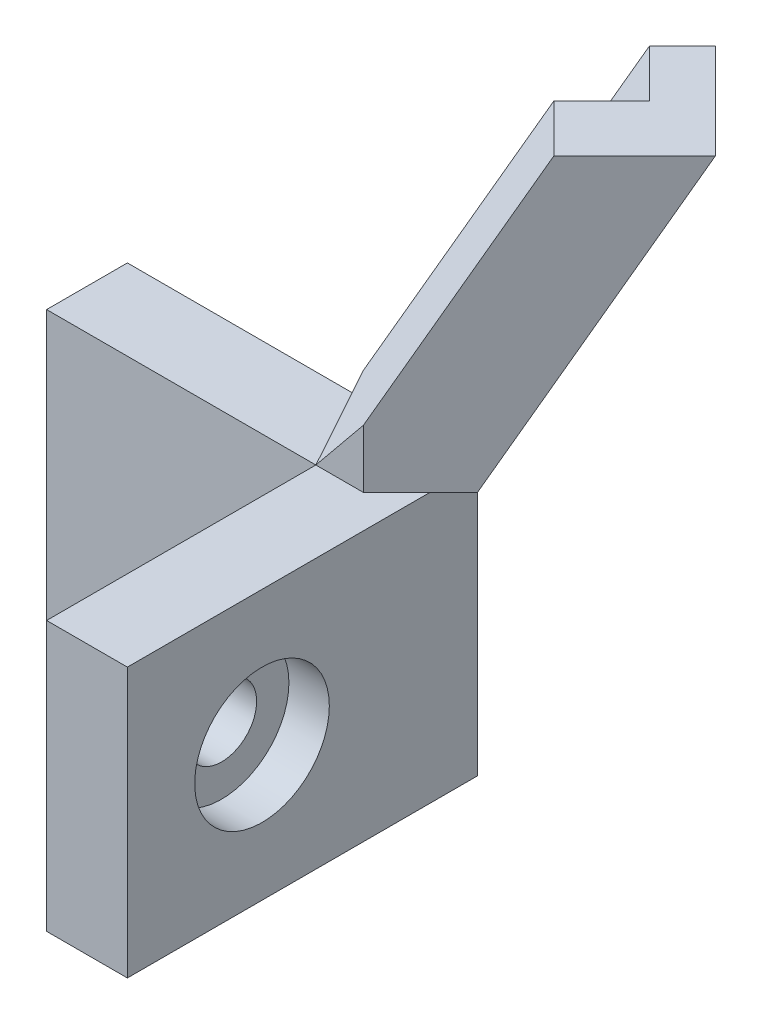
ISO-10303-21;
HEADER;
FILE_DESCRIPTION(('STEP AP214'),'2;1');
FILE_NAME('part.step','',(''),(''),'','','');
FILE_SCHEMA(('AUTOMOTIVE_DESIGN { 1 0 10303 214 1 1 1 1 }'));
ENDSEC;
DATA;
#1=APPLICATION_CONTEXT('core data for automotive mechanical design processes');
#2=APPLICATION_PROTOCOL_DEFINITION('international standard','automotive_design',2000,#1);
#3=PRODUCT_CONTEXT('',#1,'mechanical');
#4=PRODUCT('Part','Part','',(#3));
#5=PRODUCT_RELATED_PRODUCT_CATEGORY('part','',(#4));
#6=PRODUCT_DEFINITION_FORMATION('','',#4);
#7=PRODUCT_DEFINITION_CONTEXT('part definition',#1,'design');
#8=PRODUCT_DEFINITION('design','',#6,#7);
#9=PRODUCT_DEFINITION_SHAPE('','',#8);
#10=(LENGTH_UNIT() NAMED_UNIT(*) SI_UNIT(.MILLI.,.METRE.));
#11=(NAMED_UNIT(*) PLANE_ANGLE_UNIT() SI_UNIT($,.RADIAN.));
#12=(NAMED_UNIT(*) SI_UNIT($,.STERADIAN.) SOLID_ANGLE_UNIT());
#13=UNCERTAINTY_MEASURE_WITH_UNIT(LENGTH_MEASURE(1.E-05),#10,'distance_accuracy_value','');
#14=(GEOMETRIC_REPRESENTATION_CONTEXT(3) GLOBAL_UNCERTAINTY_ASSIGNED_CONTEXT((#13)) GLOBAL_UNIT_ASSIGNED_CONTEXT((#10,
#11,#12)) REPRESENTATION_CONTEXT('',''));
#15=CARTESIAN_POINT('',(0.,0.,0.));
#16=DIRECTION('',(0.,0.,1.));
#17=DIRECTION('',(1.,0.,0.));
#18=AXIS2_PLACEMENT_3D('',#15,#16,#17);
#19=CARTESIAN_POINT('',(-1.76776695296602,104.,-1.767766952966));
#20=DIRECTION('',(0.707106781186551,0.,0.707106781186544));
#21=DIRECTION('',(0.707106781186544,0.,-0.707106781186551));
#22=AXIS2_PLACEMENT_3D('',#19,#20,#21);
#23=PLANE('',#22);
#24=DIRECTION('',(0.353553390593272,0.866025403784439,-0.353553390593276));
#25=VECTOR('',#24,1.);
#26=CARTESIAN_POINT('',(-5.22860861701132,2.82576538582523,1.69307471107934));
#27=LINE('',#26,#25);
#28=CARTESIAN_POINT('',(4.16288269291295,25.8301270189222,-7.69841659884503));
#29=VERTEX_POINT('',#28);
#30=CARTESIAN_POINT('',(10.6215780690826,41.650635094611,-14.1571119750147));
#31=VERTEX_POINT('',#30);
#32=EDGE_CURVE('E221',#29,#31,#27,.T.);
#33=ORIENTED_EDGE('',*,*,#32,.F.);
#34=DIRECTION('',(0.353553390593275,0.866025403784436,-0.353553390593279));
#35=VECTOR('',#34,1.);
#36=CARTESIAN_POINT('',(4.16288269291294,25.8301270189222,-7.69841659884503));
#37=LINE('',#36,#35);
#38=CARTESIAN_POINT('',(1.78274330425076,20.,-5.31827721018282));
#39=VERTEX_POINT('',#38);
#40=EDGE_CURVE('E187',#39,#29,#37,.T.);
#41=ORIENTED_EDGE('',*,*,#40,.F.);
#42=DIRECTION('',(-0.707106781186544,0.,0.707106781186551));
#43=VECTOR('',#42,1.);
#44=CARTESIAN_POINT('',(-1.76776695296602,20.,-1.767766952966));
#45=LINE('',#44,#43);
#46=CARTESIAN_POINT('',(0.,20.,-3.53553390593204));
#47=VERTEX_POINT('',#46);
#48=EDGE_CURVE('E236',#39,#47,#45,.T.);
#49=ORIENTED_EDGE('',*,*,#48,.T.);
#50=DIRECTION('',(0.,-1.,0.));
#51=VECTOR('',#50,1.);
#52=CARTESIAN_POINT('',(0.,104.,-3.53553390593204));
#53=LINE('',#52,#51);
#54=CARTESIAN_POINT('',(0.,24.3301270189214,-3.53553390593205));
#55=VERTEX_POINT('',#54);
#56=EDGE_CURVE('E239',#55,#47,#53,.T.);
#57=ORIENTED_EDGE('',*,*,#56,.F.);
#58=DIRECTION('',(0.353553390593272,0.866025403784439,-0.353553390593276));
#59=VECTOR('',#58,1.);
#60=CARTESIAN_POINT('',(-7.89149130992393,5.,4.35595740399197));
#61=LINE('',#60,#59);
#62=CARTESIAN_POINT('',(7.07106781186578,41.650635094611,-10.6066017177979));
#63=VERTEX_POINT('',#62);
#64=EDGE_CURVE('E254',#55,#63,#61,.T.);
#65=ORIENTED_EDGE('',*,*,#64,.T.);
#66=DIRECTION('',(-0.707106781186544,0.,0.707106781186551));
#67=VECTOR('',#66,1.);
#68=CARTESIAN_POINT('',(-1.76776695296602,41.650635094611,-1.767766952966));
#69=LINE('',#68,#67);
#70=EDGE_CURVE('E251',#31,#63,#69,.T.);
#71=ORIENTED_EDGE('',*,*,#70,.F.);
#72=EDGE_LOOP('',(#33,#41,#49,#57,#65,#71));
#73=FACE_BOUND('',#72,.T.);
#74=ADVANCED_FACE('F41',(#73),#23,.F.);
#75=CARTESIAN_POINT('',(0.,104.,0.));
#76=DIRECTION('',(-1.,0.,0.));
#77=DIRECTION('',(0.,0.,1.));
#78=AXIS2_PLACEMENT_3D('',#75,#76,#77);
#79=PLANE('',#78);
#80=DIRECTION('',(0.,0.774596669241485,-0.632455532033674));
#81=VECTOR('',#80,1.);
#82=CARTESIAN_POINT('',(0.,70.4000000000002,-41.1514276787574));
#83=LINE('',#82,#81);
#84=CARTESIAN_POINT('',(0.,20.,0.));
#85=VERTEX_POINT('',#84);
#86=EDGE_CURVE('E277',#85,#55,#83,.T.);
#87=ORIENTED_EDGE('',*,*,#86,.T.);
#88=ORIENTED_EDGE('',*,*,#56,.T.);
#89=DIRECTION('',(0.,0.,-1.));
#90=VECTOR('',#89,1.);
#91=CARTESIAN_POINT('',(0.,20.,0.));
#92=LINE('',#91,#90);
#93=EDGE_CURVE('E284',#85,#47,#92,.T.);
#94=ORIENTED_EDGE('',*,*,#93,.F.);
#95=EDGE_LOOP('',(#87,#88,#94));
#96=FACE_BOUND('',#95,.T.);
#97=ADVANCED_FACE('F382',(#96),#79,.T.);
#98=CARTESIAN_POINT('',(0.,104.,0.));
#99=DIRECTION('',(0.,0.,1.));
#100=DIRECTION('',(1.,0.,0.));
#101=AXIS2_PLACEMENT_3D('',#98,#99,#100);
#102=PLANE('',#101);
#103=DIRECTION('',(-1.,0.,0.));
#104=VECTOR('',#103,1.);
#105=CARTESIAN_POINT('',(0.,20.,0.));
#106=LINE('',#105,#104);
#107=CARTESIAN_POINT('',(3.53553390593426,20.,0.));
#108=VERTEX_POINT('',#107);
#109=EDGE_CURVE('E50',#108,#85,#106,.T.);
#110=ORIENTED_EDGE('',*,*,#109,.F.);
#111=DIRECTION('',(0.,1.,0.));
#112=VECTOR('',#111,1.);
#113=CARTESIAN_POINT('',(3.53553390593425,104.,0.));
#114=LINE('',#113,#112);
#115=CARTESIAN_POINT('',(3.53553390593424,24.330127018924,0.));
#116=VERTEX_POINT('',#115);
#117=EDGE_CURVE('E247',#108,#116,#114,.T.);
#118=ORIENTED_EDGE('',*,*,#117,.T.);
#119=DIRECTION('',(-0.632455532033678,-0.774596669241482,0.));
#120=VECTOR('',#119,1.);
#121=CARTESIAN_POINT('',(41.1514276787575,70.3999999999998,0.));
#122=LINE('',#121,#120);
#123=EDGE_CURVE('E273',#116,#85,#122,.T.);
#124=ORIENTED_EDGE('',*,*,#123,.T.);
#125=EDGE_LOOP('',(#110,#118,#124));
#126=FACE_BOUND('',#125,.T.);
#127=ADVANCED_FACE('F388',(#126),#102,.T.);
#128=CARTESIAN_POINT('',(0.,20.,0.));
#129=DIRECTION('',(0.,1.,0.));
#130=DIRECTION('',(0.,0.,1.));
#131=AXIS2_PLACEMENT_3D('',#128,#129,#130);
#132=PLANE('',#131);
#133=DIRECTION('',(0.707106781186544,0.,-0.707106781186551));
#134=VECTOR('',#133,1.);
#135=CARTESIAN_POINT('',(7.76776695296711,20.,-4.2322330470329));
#136=LINE('',#135,#134);
#137=CARTESIAN_POINT('',(6.,20.,-2.46446609406577));
#138=VERTEX_POINT('',#137);
#139=CARTESIAN_POINT('',(7.76776695296711,20.,-4.2322330470329));
#140=VERTEX_POINT('',#139);
#141=EDGE_CURVE('E243',#138,#140,#136,.T.);
#142=ORIENTED_EDGE('',*,*,#141,.F.);
#143=DIRECTION('',(0.,0.,-1.));
#144=VECTOR('',#143,1.);
#145=CARTESIAN_POINT('',(6.,20.,-6.));
#146=LINE('',#145,#144);
#147=CARTESIAN_POINT('',(6.00000000000033,20.0000000000001,-5.99999999999968));
#148=VERTEX_POINT('',#147);
#149=EDGE_CURVE('E313',#138,#148,#146,.T.);
#150=ORIENTED_EDGE('',*,*,#149,.T.);
#151=DIRECTION('',(-0.707106781186551,0.,-0.707106781186544));
#152=VECTOR('',#151,1.);
#153=CARTESIAN_POINT('',(63.6292026667043,20.,51.6292026667036));
#154=LINE('',#153,#152);
#155=EDGE_CURVE('E194',#140,#148,#154,.T.);
#156=ORIENTED_EDGE('',*,*,#155,.F.);
#157=EDGE_LOOP('',(#142,#150,#156));
#158=FACE_BOUND('',#157,.T.);
#159=ADVANCED_FACE('F394',(#158),#132,.F.);
#160=CARTESIAN_POINT('',(51.5054783097464,5.,63.7529270236617));
#161=DIRECTION('',(-0.612372435695791,0.5,0.612372435695798));
#162=DIRECTION('',(0.707106781186551,0.,0.707106781186544));
#163=AXIS2_PLACEMENT_3D('',#160,#161,#162);
#164=PLANE('',#163);
#165=ORIENTED_EDGE('',*,*,#123,.F.);
#166=DIRECTION('',(-0.353553390593272,-0.866025403784439,0.353553390593276));
#167=VECTOR('',#166,1.);
#168=CARTESIAN_POINT('',(27.4874092521904,83.,-23.9518753462564));
#169=LINE('',#168,#167);
#170=CARTESIAN_POINT('',(10.6066017177989,41.650635094611,-7.07106781186477));
#171=VERTEX_POINT('',#170);
#172=EDGE_CURVE('E270',#171,#116,#169,.T.);
#173=ORIENTED_EDGE('',*,*,#172,.F.);
#174=DIRECTION('',(-0.707106781186551,0.,-0.707106781186544));
#175=VECTOR('',#174,1.);
#176=CARTESIAN_POINT('',(66.4680374315361,41.650635094611,48.7903679018718));
#177=LINE('',#176,#175);
#178=EDGE_CURVE('E262',#171,#63,#177,.T.);
#179=ORIENTED_EDGE('',*,*,#178,.T.);
#180=ORIENTED_EDGE('',*,*,#64,.F.);
#181=ORIENTED_EDGE('',*,*,#86,.F.);
#182=EDGE_LOOP('',(#165,#173,#179,#180,#181));
#183=FACE_BOUND('',#182,.T.);
#184=ADVANCED_FACE('F376',(#183),#164,.T.);
#185=CARTESIAN_POINT('',(0.,20.,0.));
#186=DIRECTION('',(0.,-1.,0.));
#187=DIRECTION('',(0.,0.,-1.));
#188=AXIS2_PLACEMENT_3D('',#185,#186,#187);
#189=PLANE('',#188);
#190=CARTESIAN_POINT('',(6.,20.,20.));
#191=VERTEX_POINT('',#190);
#192=EDGE_CURVE('E314',#191,#138,#146,.T.);
#193=ORIENTED_EDGE('',*,*,#192,.T.);
#194=EDGE_CURVE('E246',#108,#138,#136,.T.);
#195=ORIENTED_EDGE('',*,*,#194,.F.);
#196=ORIENTED_EDGE('',*,*,#109,.T.);
#197=DIRECTION('',(0.,0.,1.));
#198=VECTOR('',#197,1.);
#199=CARTESIAN_POINT('',(0.,20.,0.));
#200=LINE('',#199,#198);
#201=CARTESIAN_POINT('',(0.,20.,20.));
#202=VERTEX_POINT('',#201);
#203=EDGE_CURVE('E100',#85,#202,#200,.T.);
#204=ORIENTED_EDGE('',*,*,#203,.T.);
#205=DIRECTION('',(1.,0.,0.));
#206=VECTOR('',#205,1.);
#207=CARTESIAN_POINT('',(0.,20.,20.));
#208=LINE('',#207,#206);
#209=EDGE_CURVE('E310',#202,#191,#208,.T.);
#210=ORIENTED_EDGE('',*,*,#209,.T.);
#211=EDGE_LOOP('',(#193,#195,#196,#204,#210));
#212=FACE_BOUND('',#211,.T.);
#213=ADVANCED_FACE('F367',(#212),#189,.F.);
#214=CARTESIAN_POINT('',(-14.,10.,10.));
#215=DIRECTION('',(1.,0.,0.));
#216=DIRECTION('',(0.,0.,-1.));
#217=AXIS2_PLACEMENT_3D('',#214,#215,#216);
#218=CYLINDRICAL_SURFACE('',#217,2.6);
#219=CARTESIAN_POINT('',(0.,10.,10.));
#220=DIRECTION('',(1.,0.,0.));
#221=DIRECTION('',(0.,0.,-1.));
#222=AXIS2_PLACEMENT_3D('',#219,#220,#221);
#223=CIRCLE('',#222,2.6);
#224=CARTESIAN_POINT('',(0.,10.,7.4));
#225=VERTEX_POINT('',#224);
#226=EDGE_CURVE('E300',#225,#225,#223,.T.);
#227=ORIENTED_EDGE('',*,*,#226,.F.);
#228=EDGE_LOOP('',(#227));
#229=FACE_BOUND('',#228,.T.);
#230=CARTESIAN_POINT('',(3.,10.,10.));
#231=DIRECTION('',(1.,0.,0.));
#232=DIRECTION('',(0.,0.,-1.));
#233=AXIS2_PLACEMENT_3D('',#230,#231,#232);
#234=CIRCLE('',#233,2.6);
#235=CARTESIAN_POINT('',(3.,10.,7.4));
#236=VERTEX_POINT('',#235);
#237=EDGE_CURVE('E296',#236,#236,#234,.F.);
#238=ORIENTED_EDGE('',*,*,#237,.F.);
#239=EDGE_LOOP('',(#238));
#240=FACE_BOUND('',#239,.T.);
#241=ADVANCED_FACE('F365',(#229,#240),#218,.F.);
#242=CARTESIAN_POINT('',(0.,20.,0.));
#243=DIRECTION('',(0.,0.,-1.));
#244=DIRECTION('',(-1.,0.,0.));
#245=AXIS2_PLACEMENT_3D('',#242,#243,#244);
#246=PLANE('',#245);
#247=DIRECTION('',(1.,0.,0.));
#248=VECTOR('',#247,1.);
#249=CARTESIAN_POINT('',(0.,0.,0.));
#250=LINE('',#249,#248);
#251=CARTESIAN_POINT('',(-20.,0.,0.));
#252=VERTEX_POINT('',#251);
#253=CARTESIAN_POINT('',(0.,0.,0.));
#254=VERTEX_POINT('',#253);
#255=EDGE_CURVE('E304',#252,#254,#250,.T.);
#256=ORIENTED_EDGE('',*,*,#255,.T.);
#257=DIRECTION('',(0.,-1.,0.));
#258=VECTOR('',#257,1.);
#259=CARTESIAN_POINT('',(0.,20.,0.));
#260=LINE('',#259,#258);
#261=EDGE_CURVE('E291',#85,#254,#260,.T.);
#262=ORIENTED_EDGE('',*,*,#261,.F.);
#263=DIRECTION('',(1.,0.,0.));
#264=VECTOR('',#263,1.);
#265=CARTESIAN_POINT('',(0.,20.,0.));
#266=LINE('',#265,#264);
#267=CARTESIAN_POINT('',(-20.,20.,0.));
#268=VERTEX_POINT('',#267);
#269=EDGE_CURVE('E305',#268,#85,#266,.T.);
#270=ORIENTED_EDGE('',*,*,#269,.F.);
#271=DIRECTION('',(0.,-1.,0.));
#272=VECTOR('',#271,1.);
#273=CARTESIAN_POINT('',(-20.,20.,0.));
#274=LINE('',#273,#272);
#275=EDGE_CURVE('E322',#268,#252,#274,.T.);
#276=ORIENTED_EDGE('',*,*,#275,.T.);
#277=EDGE_LOOP('',(#256,#262,#270,#276));
#278=FACE_BOUND('',#277,.T.);
#279=ADVANCED_FACE('F43',(#278),#246,.F.);
#280=CARTESIAN_POINT('',(0.,20.,0.));
#281=DIRECTION('',(1.,0.,0.));
#282=DIRECTION('',(0.,0.,-1.));
#283=AXIS2_PLACEMENT_3D('',#280,#281,#282);
#284=PLANE('',#283);
#285=ORIENTED_EDGE('',*,*,#226,.T.);
#286=EDGE_LOOP('',(#285));
#287=FACE_BOUND('',#286,.T.);
#288=DIRECTION('',(0.,0.,1.));
#289=VECTOR('',#288,1.);
#290=CARTESIAN_POINT('',(0.,0.,0.));
#291=LINE('',#290,#289);
#292=CARTESIAN_POINT('',(0.,0.,20.));
#293=VERTEX_POINT('',#292);
#294=EDGE_CURVE('E326',#254,#293,#291,.T.);
#295=ORIENTED_EDGE('',*,*,#294,.T.);
#296=DIRECTION('',(0.,-1.,0.));
#297=VECTOR('',#296,1.);
#298=CARTESIAN_POINT('',(0.,20.,20.));
#299=LINE('',#298,#297);
#300=EDGE_CURVE('E353',#202,#293,#299,.T.);
#301=ORIENTED_EDGE('',*,*,#300,.F.);
#302=ORIENTED_EDGE('',*,*,#203,.F.);
#303=ORIENTED_EDGE('',*,*,#261,.T.);
#304=EDGE_LOOP('',(#295,#301,#302,#303));
#305=FACE_BOUND('',#304,.T.);
#306=ADVANCED_FACE('F374',(#287,#305),#284,.F.);
#307=CARTESIAN_POINT('',(0.,20.,20.));
#308=DIRECTION('',(0.,0.,-1.));
#309=DIRECTION('',(-1.,0.,0.));
#310=AXIS2_PLACEMENT_3D('',#307,#308,#309);
#311=PLANE('',#310);
#312=DIRECTION('',(1.,0.,0.));
#313=VECTOR('',#312,1.);
#314=CARTESIAN_POINT('',(0.,0.,20.));
#315=LINE('',#314,#313);
#316=CARTESIAN_POINT('',(6.,0.,20.));
#317=VERTEX_POINT('',#316);
#318=EDGE_CURVE('E329',#293,#317,#315,.T.);
#319=ORIENTED_EDGE('',*,*,#318,.T.);
#320=DIRECTION('',(0.,-1.,0.));
#321=VECTOR('',#320,1.);
#322=CARTESIAN_POINT('',(6.,20.,20.));
#323=LINE('',#322,#321);
#324=EDGE_CURVE('E349',#191,#317,#323,.T.);
#325=ORIENTED_EDGE('',*,*,#324,.F.);
#326=ORIENTED_EDGE('',*,*,#209,.F.);
#327=ORIENTED_EDGE('',*,*,#300,.T.);
#328=EDGE_LOOP('',(#319,#325,#326,#327));
#329=FACE_BOUND('',#328,.T.);
#330=ADVANCED_FACE('F419',(#329),#311,.F.);
#331=CARTESIAN_POINT('',(6.,20.,-6.));
#332=DIRECTION('',(-1.,0.,0.));
#333=DIRECTION('',(0.,0.,1.));
#334=AXIS2_PLACEMENT_3D('',#331,#332,#333);
#335=PLANE('',#334);
#336=CARTESIAN_POINT('',(6.,10.,10.));
#337=DIRECTION('',(1.,0.,0.));
#338=DIRECTION('',(0.,0.,-1.));
#339=AXIS2_PLACEMENT_3D('',#336,#337,#338);
#340=CIRCLE('',#339,5.);
#341=CARTESIAN_POINT('',(6.,10.,5.));
#342=VERTEX_POINT('',#341);
#343=EDGE_CURVE('E288',#342,#342,#340,.T.);
#344=ORIENTED_EDGE('',*,*,#343,.F.);
#345=EDGE_LOOP('',(#344));
#346=FACE_BOUND('',#345,.T.);
#347=DIRECTION('',(0.,0.,-1.));
#348=VECTOR('',#347,1.);
#349=CARTESIAN_POINT('',(6.,0.,-6.));
#350=LINE('',#349,#348);
#351=CARTESIAN_POINT('',(6.,0.,-6.));
#352=VERTEX_POINT('',#351);
#353=EDGE_CURVE('E332',#317,#352,#350,.T.);
#354=ORIENTED_EDGE('',*,*,#353,.T.);
#355=DIRECTION('',(0.,-1.,0.));
#356=VECTOR('',#355,1.);
#357=CARTESIAN_POINT('',(6.,20.,-6.));
#358=LINE('',#357,#356);
#359=EDGE_CURVE('E345',#148,#352,#358,.T.);
#360=ORIENTED_EDGE('',*,*,#359,.F.);
#361=ORIENTED_EDGE('',*,*,#149,.F.);
#362=ORIENTED_EDGE('',*,*,#192,.F.);
#363=ORIENTED_EDGE('',*,*,#324,.T.);
#364=EDGE_LOOP('',(#354,#360,#361,#362,#363));
#365=FACE_BOUND('',#364,.T.);
#366=ADVANCED_FACE('F415',(#346,#365),#335,.F.);
#367=CARTESIAN_POINT('',(-20.,20.,-6.));
#368=DIRECTION('',(0.,0.,1.));
#369=DIRECTION('',(1.,0.,0.));
#370=AXIS2_PLACEMENT_3D('',#367,#368,#369);
#371=PLANE('',#370);
#372=DIRECTION('',(-1.,0.,0.));
#373=VECTOR('',#372,1.);
#374=CARTESIAN_POINT('',(-20.,0.,-6.));
#375=LINE('',#374,#373);
#376=CARTESIAN_POINT('',(-20.,0.,-6.));
#377=VERTEX_POINT('',#376);
#378=EDGE_CURVE('E335',#352,#377,#375,.T.);
#379=ORIENTED_EDGE('',*,*,#378,.T.);
#380=DIRECTION('',(0.,-1.,0.));
#381=VECTOR('',#380,1.);
#382=CARTESIAN_POINT('',(-20.,20.,-6.));
#383=LINE('',#382,#381);
#384=CARTESIAN_POINT('',(-20.,20.,-6.));
#385=VERTEX_POINT('',#384);
#386=EDGE_CURVE('E342',#385,#377,#383,.T.);
#387=ORIENTED_EDGE('',*,*,#386,.F.);
#388=DIRECTION('',(-1.,0.,0.));
#389=VECTOR('',#388,1.);
#390=CARTESIAN_POINT('',(-20.,20.,-6.));
#391=LINE('',#390,#389);
#392=EDGE_CURVE('E317',#148,#385,#391,.T.);
#393=ORIENTED_EDGE('',*,*,#392,.F.);
#394=ORIENTED_EDGE('',*,*,#359,.T.);
#395=EDGE_LOOP('',(#379,#387,#393,#394));
#396=FACE_BOUND('',#395,.T.);
#397=ADVANCED_FACE('F418',(#396),#371,.F.);
#398=CARTESIAN_POINT('',(-20.,20.,0.));
#399=DIRECTION('',(1.,0.,0.));
#400=DIRECTION('',(0.,0.,-1.));
#401=AXIS2_PLACEMENT_3D('',#398,#399,#400);
#402=PLANE('',#401);
#403=DIRECTION('',(0.,0.,1.));
#404=VECTOR('',#403,1.);
#405=CARTESIAN_POINT('',(-20.,0.,0.));
#406=LINE('',#405,#404);
#407=EDGE_CURVE('E92',#377,#252,#406,.T.);
#408=ORIENTED_EDGE('',*,*,#407,.T.);
#409=ORIENTED_EDGE('',*,*,#275,.F.);
#410=DIRECTION('',(0.,0.,1.));
#411=VECTOR('',#410,1.);
#412=CARTESIAN_POINT('',(-20.,20.,0.));
#413=LINE('',#412,#411);
#414=EDGE_CURVE('E65',#385,#268,#413,.T.);
#415=ORIENTED_EDGE('',*,*,#414,.F.);
#416=ORIENTED_EDGE('',*,*,#386,.T.);
#417=EDGE_LOOP('',(#408,#409,#415,#416));
#418=FACE_BOUND('',#417,.T.);
#419=ADVANCED_FACE('F434',(#418),#402,.F.);
#420=ORIENTED_EDGE('',*,*,#392,.T.);
#421=ORIENTED_EDGE('',*,*,#414,.T.);
#422=ORIENTED_EDGE('',*,*,#269,.T.);
#423=ORIENTED_EDGE('',*,*,#93,.T.);
#424=ORIENTED_EDGE('',*,*,#48,.F.);
#425=DIRECTION('',(-0.707106781186551,0.,-0.707106781186544));
#426=VECTOR('',#425,1.);
#427=CARTESIAN_POINT('',(3.55051025721714,20.,-3.55051025721646));
#428=LINE('',#427,#426);
#429=CARTESIAN_POINT('',(3.55051025721714,20.,-3.55051025721646));
#430=VERTEX_POINT('',#429);
#431=EDGE_CURVE('E204',#430,#39,#428,.T.);
#432=ORIENTED_EDGE('',*,*,#431,.F.);
#433=DIRECTION('',(-0.707106781186544,0.,0.707106781186551));
#434=VECTOR('',#433,1.);
#435=CARTESIAN_POINT('',(3.55051025721714,20.,-3.55051025721646));
#436=LINE('',#435,#434);
#437=EDGE_CURVE('E197',#148,#430,#436,.T.);
#438=ORIENTED_EDGE('',*,*,#437,.F.);
#439=EDGE_LOOP('',(#420,#421,#422,#423,#424,#432,#438));
#440=FACE_BOUND('',#439,.T.);
#441=ADVANCED_FACE('F378',(#440),#189,.F.);
#442=CARTESIAN_POINT('',(0.,0.,0.));
#443=DIRECTION('',(0.,-1.,0.));
#444=DIRECTION('',(0.,0.,-1.));
#445=AXIS2_PLACEMENT_3D('',#442,#443,#444);
#446=PLANE('',#445);
#447=ORIENTED_EDGE('',*,*,#255,.F.);
#448=ORIENTED_EDGE('',*,*,#407,.F.);
#449=ORIENTED_EDGE('',*,*,#378,.F.);
#450=ORIENTED_EDGE('',*,*,#353,.F.);
#451=ORIENTED_EDGE('',*,*,#318,.F.);
#452=ORIENTED_EDGE('',*,*,#294,.F.);
#453=EDGE_LOOP('',(#447,#448,#449,#450,#451,#452));
#454=FACE_BOUND('',#453,.T.);
#455=ADVANCED_FACE('F405',(#454),#446,.T.);
#456=CARTESIAN_POINT('',(3.,10.,10.));
#457=DIRECTION('',(1.,0.,0.));
#458=DIRECTION('',(0.,0.,-1.));
#459=AXIS2_PLACEMENT_3D('',#456,#457,#458);
#460=PLANE('',#459);
#461=CARTESIAN_POINT('',(3.,10.,10.));
#462=DIRECTION('',(1.,0.,0.));
#463=DIRECTION('',(0.,0.,-1.));
#464=AXIS2_PLACEMENT_3D('',#461,#462,#463);
#465=CIRCLE('',#464,5.);
#466=CARTESIAN_POINT('',(3.,10.,5.));
#467=VERTEX_POINT('',#466);
#468=EDGE_CURVE('E292',#467,#467,#465,.T.);
#469=ORIENTED_EDGE('',*,*,#468,.T.);
#470=EDGE_LOOP('',(#469));
#471=FACE_BOUND('',#470,.T.);
#472=ORIENTED_EDGE('',*,*,#237,.T.);
#473=EDGE_LOOP('',(#472));
#474=FACE_BOUND('',#473,.T.);
#475=ADVANCED_FACE('F363',(#471,#474),#460,.T.);
#476=CARTESIAN_POINT('',(3.,10.,10.));
#477=DIRECTION('',(1.,0.,0.));
#478=DIRECTION('',(0.,0.,-1.));
#479=AXIS2_PLACEMENT_3D('',#476,#477,#478);
#480=CYLINDRICAL_SURFACE('',#479,5.);
#481=ORIENTED_EDGE('',*,*,#468,.F.);
#482=EDGE_LOOP('',(#481));
#483=FACE_BOUND('',#482,.T.);
#484=ORIENTED_EDGE('',*,*,#343,.T.);
#485=EDGE_LOOP('',(#484));
#486=FACE_BOUND('',#485,.T.);
#487=ADVANCED_FACE('F399',(#483,#486),#480,.F.);
#488=CARTESIAN_POINT('',(1.76776695296715,104.,1.76776695296713));
#489=DIRECTION('',(0.707106781186551,0.,0.707106781186544));
#490=DIRECTION('',(0.707106781186544,0.,-0.707106781186551));
#491=AXIS2_PLACEMENT_3D('',#488,#489,#490);
#492=PLANE('',#491);
#493=DIRECTION('',(-0.353553390593272,-0.866025403784439,0.353553390593276));
#494=VECTOR('',#493,1.);
#495=CARTESIAN_POINT('',(31.9874092521904,79.3257653858252,-28.4518753462564));
#496=LINE('',#495,#494);
#497=CARTESIAN_POINT('',(16.6066017177989,41.650635094611,-13.0710678118648));
#498=VERTEX_POINT('',#497);
#499=EDGE_CURVE('E281',#498,#140,#496,.T.);
#500=ORIENTED_EDGE('',*,*,#499,.F.);
#501=DIRECTION('',(0.707106781186544,0.,-0.707106781186551));
#502=VECTOR('',#501,1.);
#503=CARTESIAN_POINT('',(1.76776695296715,41.650635094611,1.76776695296713));
#504=LINE('',#503,#502);
#505=EDGE_CURVE('E261',#171,#498,#504,.T.);
#506=ORIENTED_EDGE('',*,*,#505,.F.);
#507=ORIENTED_EDGE('',*,*,#172,.T.);
#508=ORIENTED_EDGE('',*,*,#117,.F.);
#509=ORIENTED_EDGE('',*,*,#194,.T.);
#510=ORIENTED_EDGE('',*,*,#141,.T.);
#511=EDGE_LOOP('',(#500,#506,#507,#508,#509,#510));
#512=FACE_BOUND('',#511,.T.);
#513=ADVANCED_FACE('F396',(#512),#492,.T.);
#514=CARTESIAN_POINT('',(56.0054783097464,1.32576538582523,59.2529270236616));
#515=DIRECTION('',(-0.612372435695791,0.5,0.612372435695798));
#516=DIRECTION('',(0.707106781186551,0.,0.707106781186544));
#517=AXIS2_PLACEMENT_3D('',#514,#515,#516);
#518=PLANE('',#517);
#519=DIRECTION('',(-0.353553390593275,-0.866025403784436,0.353553390593279));
#520=VECTOR('',#519,1.);
#521=CARTESIAN_POINT('',(6.00000000000033,20.0000000000001,-5.99999999999968));
#522=LINE('',#521,#520);
#523=CARTESIAN_POINT('',(7.76776695296669,24.3301270189222,-7.76776695296606));
#524=VERTEX_POINT('',#523);
#525=EDGE_CURVE('E182',#524,#148,#522,.T.);
#526=ORIENTED_EDGE('',*,*,#525,.F.);
#527=DIRECTION('',(0.707106781186551,0.,0.707106781186544));
#528=VECTOR('',#527,1.);
#529=CARTESIAN_POINT('',(7.76776695296634,24.3301270189222,-7.76776695296642));
#530=LINE('',#529,#528);
#531=CARTESIAN_POINT('',(2.46446609406755,24.3301270189222,-13.0710678118652));
#532=VERTEX_POINT('',#531);
#533=EDGE_CURVE('E161',#532,#524,#530,.T.);
#534=ORIENTED_EDGE('',*,*,#533,.F.);
#535=DIRECTION('',(-0.353553390593272,-0.866025403784439,0.353553390593275));
#536=VECTOR('',#535,1.);
#537=CARTESIAN_POINT('',(-6.92702521585672,1.32576538582523,-3.67957650194079));
#538=LINE('',#537,#536);
#539=CARTESIAN_POINT('',(9.53553390593298,41.650635094611,-20.1421356237306));
#540=VERTEX_POINT('',#539);
#541=EDGE_CURVE('E176',#540,#532,#538,.T.);
#542=ORIENTED_EDGE('',*,*,#541,.F.);
#543=DIRECTION('',(-0.707106781186551,0.,-0.707106781186544));
#544=VECTOR('',#543,1.);
#545=CARTESIAN_POINT('',(72.4680374315361,41.650635094611,42.7903679018718));
#546=LINE('',#545,#544);
#547=EDGE_CURVE('E258',#498,#540,#546,.T.);
#548=ORIENTED_EDGE('',*,*,#547,.F.);
#549=ORIENTED_EDGE('',*,*,#499,.T.);
#550=ORIENTED_EDGE('',*,*,#155,.T.);
#551=EDGE_LOOP('',(#526,#534,#542,#548,#549,#550));
#552=FACE_BOUND('',#551,.T.);
#553=CARTESIAN_POINT('',(7.76776695296665,32.9903810567666,-14.8388347648315));
#554=DIRECTION('',(0.612372435695791,-0.5,-0.612372435695798));
#555=DIRECTION('',(-0.707106781186551,0.,-0.707106781186544));
#556=AXIS2_PLACEMENT_3D('',#553,#554,#555);
#557=CIRCLE('',#556,1.5);
#558=CARTESIAN_POINT('',(6.70710678118683,32.9903810567666,-15.8994949366114));
#559=VERTEX_POINT('',#558);
#560=EDGE_CURVE('E214',#559,#559,#557,.T.);
#561=ORIENTED_EDGE('',*,*,#560,.F.);
#562=EDGE_LOOP('',(#561));
#563=FACE_BOUND('',#562,.T.);
#564=ADVANCED_FACE('F190',(#552,#563),#518,.F.);
#565=CARTESIAN_POINT('',(57.6292026667043,41.650635094611,57.6292026667037));
#566=DIRECTION('',(0.,-1.,0.));
#567=DIRECTION('',(0.,0.,-1.));
#568=AXIS2_PLACEMENT_3D('',#565,#566,#567);
#569=PLANE('',#568);
#570=ORIENTED_EDGE('',*,*,#505,.T.);
#571=ORIENTED_EDGE('',*,*,#547,.T.);
#572=DIRECTION('',(0.707106781186544,0.,-0.707106781186551));
#573=VECTOR('',#572,1.);
#574=CARTESIAN_POINT('',(-8.7641425229442,41.6506350946109,-1.84245919485328));
#575=LINE('',#574,#573);
#576=CARTESIAN_POINT('',(7.08604416314982,41.650635094611,-17.6926458809475));
#577=VERTEX_POINT('',#576);
#578=EDGE_CURVE('E57',#577,#540,#575,.T.);
#579=ORIENTED_EDGE('',*,*,#578,.F.);
#580=DIRECTION('',(-0.707106781186551,0.,-0.707106781186544));
#581=VECTOR('',#580,1.);
#582=CARTESIAN_POINT('',(12.3893450220486,41.650635094611,-12.3893450220487));
#583=LINE('',#582,#581);
#584=EDGE_CURVE('E11',#31,#577,#583,.T.);
#585=ORIENTED_EDGE('',*,*,#584,.F.);
#586=ORIENTED_EDGE('',*,*,#70,.T.);
#587=ORIENTED_EDGE('',*,*,#178,.F.);
#588=EDGE_LOOP('',(#570,#571,#579,#585,#586,#587));
#589=FACE_BOUND('',#588,.T.);
#590=ADVANCED_FACE('F473',(#589),#569,.F.);
#591=CARTESIAN_POINT('',(-8.7641425229441,2.82576538582523,-1.8424591948534));
#592=DIRECTION('',(0.707106781186551,0.,0.707106781186544));
#593=DIRECTION('',(0.707106781186544,0.,-0.707106781186551));
#594=AXIS2_PLACEMENT_3D('',#591,#592,#593);
#595=PLANE('',#594);
#596=DIRECTION('',(-0.353553390593272,-0.866025403784439,0.353553390593275));
#597=VECTOR('',#596,1.);
#598=CARTESIAN_POINT('',(-8.7641425229441,2.82576538582523,-1.8424591948534));
#599=LINE('',#598,#597);
#600=CARTESIAN_POINT('',(0.627348786980179,25.8301270189222,-11.2339505047778));
#601=VERTEX_POINT('',#600);
#602=EDGE_CURVE('E218',#577,#601,#599,.T.);
#603=ORIENTED_EDGE('',*,*,#602,.F.);
#604=ORIENTED_EDGE('',*,*,#578,.T.);
#605=ORIENTED_EDGE('',*,*,#541,.T.);
#606=DIRECTION('',(0.612372435695791,-0.5,-0.612372435695798));
#607=VECTOR('',#606,1.);
#608=CARTESIAN_POINT('',(0.627348786980179,25.8301270189222,-11.2339505047778));
#609=LINE('',#608,#607);
#610=EDGE_CURVE('E169',#601,#532,#609,.T.);
#611=ORIENTED_EDGE('',*,*,#610,.F.);
#612=EDGE_LOOP('',(#603,#604,#605,#611));
#613=FACE_BOUND('',#612,.T.);
#614=ADVANCED_FACE('F475',(#613),#595,.F.);
#615=CARTESIAN_POINT('',(5.93064964587897,25.8301270189222,-5.93064964587903));
#616=DIRECTION('',(0.353553390593272,0.866025403784439,-0.353553390593276));
#617=DIRECTION('',(0.,0.377964473009229,0.925820099772551));
#618=AXIS2_PLACEMENT_3D('',#615,#616,#617);
#619=PLANE('',#618);
#620=ORIENTED_EDGE('',*,*,#533,.T.);
#621=DIRECTION('',(0.612372435695791,-0.500000000000001,-0.612372435695798));
#622=VECTOR('',#621,1.);
#623=CARTESIAN_POINT('',(7.76776695296669,24.3301270189222,-7.76776695296606));
#624=LINE('',#623,#622);
#625=CARTESIAN_POINT('',(5.93064964587932,25.8301270189222,-5.93064964587867));
#626=VERTEX_POINT('',#625);
#627=EDGE_CURVE('E165',#626,#524,#624,.T.);
#628=ORIENTED_EDGE('',*,*,#627,.F.);
#629=DIRECTION('',(-0.707106781186551,0.,-0.707106781186544));
#630=VECTOR('',#629,1.);
#631=CARTESIAN_POINT('',(5.93064964587932,25.8301270189222,-5.93064964587867));
#632=LINE('',#631,#630);
#633=EDGE_CURVE('E207',#626,#29,#632,.T.);
#634=ORIENTED_EDGE('',*,*,#633,.T.);
#635=DIRECTION('',(0.707106781186551,0.,0.707106781186544));
#636=VECTOR('',#635,1.);
#637=CARTESIAN_POINT('',(5.93064964587897,25.8301270189222,-5.93064964587903));
#638=LINE('',#637,#636);
#639=EDGE_CURVE('E225',#601,#29,#638,.T.);
#640=ORIENTED_EDGE('',*,*,#639,.F.);
#641=ORIENTED_EDGE('',*,*,#610,.T.);
#642=EDGE_LOOP('',(#620,#628,#634,#640,#641));
#643=FACE_BOUND('',#642,.T.);
#644=ADVANCED_FACE('F163',(#643),#619,.F.);
#645=CARTESIAN_POINT('',(5.93064964587928,34.4903810567666,-13.0017174577442));
#646=DIRECTION('',(0.612372435695791,-0.5,-0.612372435695798));
#647=DIRECTION('',(-0.707106781186551,0.,-0.707106781186544));
#648=AXIS2_PLACEMENT_3D('',#645,#646,#647);
#649=CYLINDRICAL_SURFACE('',#648,1.5);
#650=CARTESIAN_POINT('',(5.93064964587928,34.4903810567666,-13.0017174577442));
#651=DIRECTION('',(0.612372435695791,-0.5,-0.612372435695798));
#652=DIRECTION('',(-0.707106781186551,0.,-0.707106781186544));
#653=AXIS2_PLACEMENT_3D('',#650,#651,#652);
#654=CIRCLE('',#653,1.5);
#655=CARTESIAN_POINT('',(4.86998947409946,34.4903810567666,-14.062377629524));
#656=VERTEX_POINT('',#655);
#657=EDGE_CURVE('E175',#656,#656,#654,.T.);
#658=ORIENTED_EDGE('',*,*,#657,.F.);
#659=EDGE_LOOP('',(#658));
#660=FACE_BOUND('',#659,.T.);
#661=ORIENTED_EDGE('',*,*,#560,.T.);
#662=EDGE_LOOP('',(#661));
#663=FACE_BOUND('',#662,.T.);
#664=ADVANCED_FACE('F471',(#660,#663),#649,.F.);
#665=CARTESIAN_POINT('',(-3.4608416640453,2.82576538582523,3.46084166404534));
#666=DIRECTION('',(0.612372435695791,-0.5,-0.612372435695798));
#667=DIRECTION('',(-0.707106781186551,0.,-0.707106781186544));
#668=AXIS2_PLACEMENT_3D('',#665,#666,#667);
#669=PLANE('',#668);
#670=ORIENTED_EDGE('',*,*,#657,.T.);
#671=EDGE_LOOP('',(#670));
#672=FACE_BOUND('',#671,.T.);
#673=ORIENTED_EDGE('',*,*,#32,.T.);
#674=ORIENTED_EDGE('',*,*,#584,.T.);
#675=ORIENTED_EDGE('',*,*,#602,.T.);
#676=ORIENTED_EDGE('',*,*,#639,.T.);
#677=EDGE_LOOP('',(#673,#674,#675,#676));
#678=FACE_BOUND('',#677,.T.);
#679=ADVANCED_FACE('F505',(#672,#678),#669,.F.);
#680=CARTESIAN_POINT('',(5.93064964587932,25.8301270189222,-5.93064964587867));
#681=DIRECTION('',(-0.612372435695789,0.500000000000004,0.612372435695796));
#682=DIRECTION('',(0.707106781186551,0.,0.707106781186544));
#683=AXIS2_PLACEMENT_3D('',#680,#681,#682);
#684=PLANE('',#683);
#685=ORIENTED_EDGE('',*,*,#40,.T.);
#686=ORIENTED_EDGE('',*,*,#633,.F.);
#687=DIRECTION('',(0.353553390593275,0.866025403784436,-0.353553390593279));
#688=VECTOR('',#687,1.);
#689=CARTESIAN_POINT('',(5.93064964587932,25.8301270189222,-5.93064964587867));
#690=LINE('',#689,#688);
#691=EDGE_CURVE('E185',#430,#626,#690,.T.);
#692=ORIENTED_EDGE('',*,*,#691,.F.);
#693=ORIENTED_EDGE('',*,*,#431,.T.);
#694=EDGE_LOOP('',(#685,#686,#692,#693));
#695=FACE_BOUND('',#694,.T.);
#696=ADVANCED_FACE('F511',(#695),#684,.F.);
#697=CARTESIAN_POINT('',(3.5301622736128E-13,0.,3.53449908230274E-13));
#698=DIRECTION('',(0.707106781186551,0.,0.707106781186544));
#699=DIRECTION('',(0.707106781186544,0.,-0.707106781186551));
#700=AXIS2_PLACEMENT_3D('',#697,#698,#699);
#701=PLANE('',#700);
#702=ORIENTED_EDGE('',*,*,#627,.T.);
#703=ORIENTED_EDGE('',*,*,#525,.T.);
#704=ORIENTED_EDGE('',*,*,#437,.T.);
#705=ORIENTED_EDGE('',*,*,#691,.T.);
#706=EDGE_LOOP('',(#702,#703,#704,#705));
#707=FACE_BOUND('',#706,.T.);
#708=ADVANCED_FACE('F180',(#707),#701,.F.);
#709=CLOSED_SHELL('',(#74,#97,#127,#159,#184,#213,#241,#279,#306,#330,#366,#397,#419,#441,#455,
#475,#487,#513,#564,#590,#614,#644,#664,#679,#696,#708));
#710=MANIFOLD_SOLID_BREP('B2',#709);
#711=ADVANCED_BREP_SHAPE_REPRESENTATION('',(#18,#710),#14);
#712=SHAPE_DEFINITION_REPRESENTATION(#9,#711);
ENDSEC;
END-ISO-10303-21;
